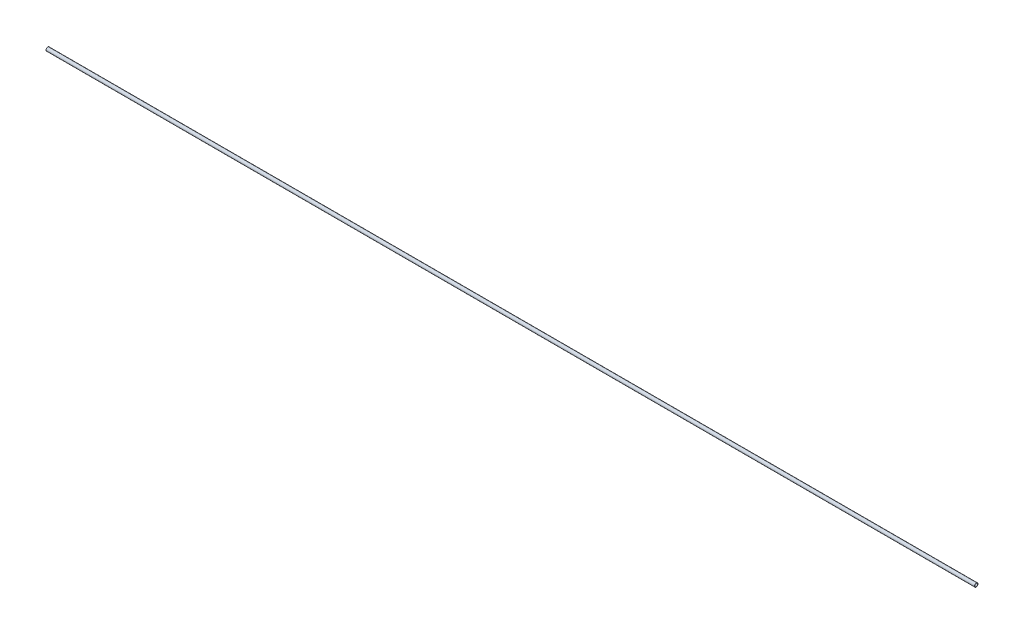
ISO-10303-21;
HEADER;
FILE_DESCRIPTION(('STEP AP214'),'2;1');
FILE_NAME('part.step','',(''),(''),'','','');
FILE_SCHEMA(('AUTOMOTIVE_DESIGN { 1 0 10303 214 1 1 1 1 }'));
ENDSEC;
DATA;
#1=APPLICATION_CONTEXT('core data for automotive mechanical design processes');
#2=APPLICATION_PROTOCOL_DEFINITION('international standard','automotive_design',2000,#1);
#3=PRODUCT_CONTEXT('',#1,'mechanical');
#4=PRODUCT('Part','Part','',(#3));
#5=PRODUCT_RELATED_PRODUCT_CATEGORY('part','',(#4));
#6=PRODUCT_DEFINITION_FORMATION('','',#4);
#7=PRODUCT_DEFINITION_CONTEXT('part definition',#1,'design');
#8=PRODUCT_DEFINITION('design','',#6,#7);
#9=PRODUCT_DEFINITION_SHAPE('','',#8);
#10=(LENGTH_UNIT() NAMED_UNIT(*) SI_UNIT(.MILLI.,.METRE.));
#11=(NAMED_UNIT(*) PLANE_ANGLE_UNIT() SI_UNIT($,.RADIAN.));
#12=(NAMED_UNIT(*) SI_UNIT($,.STERADIAN.) SOLID_ANGLE_UNIT());
#13=UNCERTAINTY_MEASURE_WITH_UNIT(LENGTH_MEASURE(1.E-05),#10,'distance_accuracy_value','');
#14=(GEOMETRIC_REPRESENTATION_CONTEXT(3) GLOBAL_UNCERTAINTY_ASSIGNED_CONTEXT((#13)) GLOBAL_UNIT_ASSIGNED_CONTEXT((#10,
#11,#12)) REPRESENTATION_CONTEXT('',''));
#15=CARTESIAN_POINT('',(0.,0.,0.));
#16=DIRECTION('',(0.,0.,1.));
#17=DIRECTION('',(1.,0.,0.));
#18=AXIS2_PLACEMENT_3D('',#15,#16,#17);
#19=CARTESIAN_POINT('',(10000.,0.,0.));
#20=DIRECTION('',(1.,0.,0.));
#21=DIRECTION('',(0.,0.,-1.));
#22=AXIS2_PLACEMENT_3D('',#19,#20,#21);
#23=PLANE('',#22);
#24=CARTESIAN_POINT('',(10000.,0.,0.));
#25=DIRECTION('',(1.,0.,0.));
#26=DIRECTION('',(0.,0.,-1.));
#27=AXIS2_PLACEMENT_3D('',#24,#25,#26);
#28=CIRCLE('',#27,19.);
#29=CARTESIAN_POINT('',(10000.,0.,-19.));
#30=VERTEX_POINT('',#29);
#31=EDGE_CURVE('E10',#30,#30,#28,.T.);
#32=ORIENTED_EDGE('',*,*,#31,.T.);
#33=EDGE_LOOP('',(#32));
#34=FACE_BOUND('',#33,.T.);
#35=CARTESIAN_POINT('',(10000.,0.,0.));
#36=DIRECTION('',(1.,0.,0.));
#37=DIRECTION('',(0.,0.,-1.));
#38=AXIS2_PLACEMENT_3D('',#35,#36,#37);
#39=CIRCLE('',#38,15.);
#40=CARTESIAN_POINT('',(10000.,0.,-15.));
#41=VERTEX_POINT('',#40);
#42=EDGE_CURVE('E42',#41,#41,#39,.T.);
#43=ORIENTED_EDGE('',*,*,#42,.F.);
#44=EDGE_LOOP('',(#43));
#45=FACE_BOUND('',#44,.T.);
#46=ADVANCED_FACE('F31',(#34,#45),#23,.T.);
#47=CARTESIAN_POINT('',(0.,0.,0.));
#48=DIRECTION('',(1.,0.,0.));
#49=DIRECTION('',(0.,0.,-1.));
#50=AXIS2_PLACEMENT_3D('',#47,#48,#49);
#51=PLANE('',#50);
#52=CARTESIAN_POINT('',(0.,0.,0.));
#53=DIRECTION('',(1.,0.,0.));
#54=DIRECTION('',(0.,0.,-1.));
#55=AXIS2_PLACEMENT_3D('',#52,#53,#54);
#56=CIRCLE('',#55,19.);
#57=CARTESIAN_POINT('',(0.,0.,-19.));
#58=VERTEX_POINT('',#57);
#59=EDGE_CURVE('E35',#58,#58,#56,.T.);
#60=ORIENTED_EDGE('',*,*,#59,.F.);
#61=EDGE_LOOP('',(#60));
#62=FACE_BOUND('',#61,.T.);
#63=CARTESIAN_POINT('',(0.,0.,0.));
#64=DIRECTION('',(1.,0.,0.));
#65=DIRECTION('',(0.,0.,-1.));
#66=AXIS2_PLACEMENT_3D('',#63,#64,#65);
#67=CIRCLE('',#66,15.);
#68=CARTESIAN_POINT('',(0.,0.,-15.));
#69=VERTEX_POINT('',#68);
#70=EDGE_CURVE('E44',#69,#69,#67,.T.);
#71=ORIENTED_EDGE('',*,*,#70,.T.);
#72=EDGE_LOOP('',(#71));
#73=FACE_BOUND('',#72,.T.);
#74=ADVANCED_FACE('F54',(#62,#73),#51,.F.);
#75=CARTESIAN_POINT('',(10000.,0.,0.));
#76=DIRECTION('',(-1.,0.,0.));
#77=DIRECTION('',(0.,0.,1.));
#78=AXIS2_PLACEMENT_3D('',#75,#76,#77);
#79=CYLINDRICAL_SURFACE('',#78,19.);
#80=ORIENTED_EDGE('',*,*,#31,.F.);
#81=EDGE_LOOP('',(#80));
#82=FACE_BOUND('',#81,.T.);
#83=ORIENTED_EDGE('',*,*,#59,.T.);
#84=EDGE_LOOP('',(#83));
#85=FACE_BOUND('',#84,.T.);
#86=ADVANCED_FACE('F33',(#82,#85),#79,.T.);
#87=CARTESIAN_POINT('',(10000.,0.,0.));
#88=DIRECTION('',(-1.,0.,0.));
#89=DIRECTION('',(0.,0.,1.));
#90=AXIS2_PLACEMENT_3D('',#87,#88,#89);
#91=CYLINDRICAL_SURFACE('',#90,15.);
#92=ORIENTED_EDGE('',*,*,#42,.T.);
#93=EDGE_LOOP('',(#92));
#94=FACE_BOUND('',#93,.T.);
#95=ORIENTED_EDGE('',*,*,#70,.F.);
#96=EDGE_LOOP('',(#95));
#97=FACE_BOUND('',#96,.T.);
#98=ADVANCED_FACE('F50',(#94,#97),#91,.F.);
#99=CLOSED_SHELL('',(#46,#74,#86,#98));
#100=MANIFOLD_SOLID_BREP('B2',#99);
#101=ADVANCED_BREP_SHAPE_REPRESENTATION('',(#18,#100),#14);
#102=SHAPE_DEFINITION_REPRESENTATION(#9,#101);
ENDSEC;
END-ISO-10303-21;
